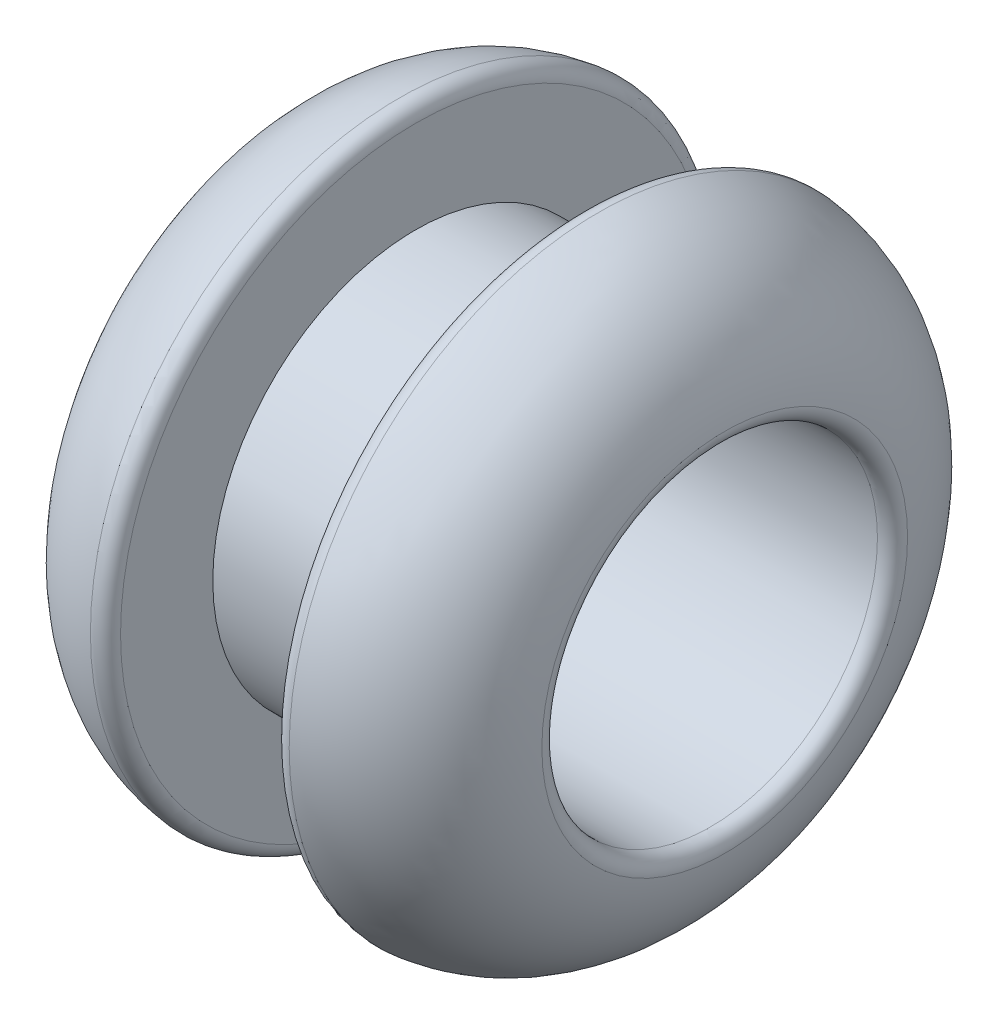
ISO-10303-21;
HEADER;
FILE_DESCRIPTION(('STEP AP214'),'2;1');
FILE_NAME('part.step','',(''),(''),'','','');
FILE_SCHEMA(('AUTOMOTIVE_DESIGN { 1 0 10303 214 1 1 1 1 }'));
ENDSEC;
DATA;
#1=APPLICATION_CONTEXT('core data for automotive mechanical design processes');
#2=APPLICATION_PROTOCOL_DEFINITION('international standard','automotive_design',2000,#1);
#3=PRODUCT_CONTEXT('',#1,'mechanical');
#4=PRODUCT('Part','Part','',(#3));
#5=PRODUCT_RELATED_PRODUCT_CATEGORY('part','',(#4));
#6=PRODUCT_DEFINITION_FORMATION('','',#4);
#7=PRODUCT_DEFINITION_CONTEXT('part definition',#1,'design');
#8=PRODUCT_DEFINITION('design','',#6,#7);
#9=PRODUCT_DEFINITION_SHAPE('','',#8);
#10=(LENGTH_UNIT() NAMED_UNIT(*) SI_UNIT(.MILLI.,.METRE.));
#11=(NAMED_UNIT(*) PLANE_ANGLE_UNIT() SI_UNIT($,.RADIAN.));
#12=(NAMED_UNIT(*) SI_UNIT($,.STERADIAN.) SOLID_ANGLE_UNIT());
#13=UNCERTAINTY_MEASURE_WITH_UNIT(LENGTH_MEASURE(1.E-05),#10,'distance_accuracy_value','');
#14=(GEOMETRIC_REPRESENTATION_CONTEXT(3) GLOBAL_UNCERTAINTY_ASSIGNED_CONTEXT((#13)) GLOBAL_UNIT_ASSIGNED_CONTEXT((#10,
#11,#12)) REPRESENTATION_CONTEXT('',''));
#15=CARTESIAN_POINT('',(0.,0.,0.));
#16=DIRECTION('',(0.,0.,1.));
#17=DIRECTION('',(1.,0.,0.));
#18=AXIS2_PLACEMENT_3D('',#15,#16,#17);
#19=CARTESIAN_POINT('',(-6.63598887259671,0.,1.75));
#20=DIRECTION('',(-1.,0.,0.));
#21=DIRECTION('',(0.,0.,1.));
#22=AXIS2_PLACEMENT_3D('',#19,#20,#21);
#23=CYLINDRICAL_SURFACE('',#22,1.75);
#24=CARTESIAN_POINT('',(-0.158359213500126,0.,1.75));
#25=DIRECTION('',(1.,0.,0.));
#26=DIRECTION('',(0.,0.,-1.));
#27=AXIS2_PLACEMENT_3D('',#24,#25,#26);
#28=CIRCLE('',#27,1.75);
#29=CARTESIAN_POINT('',(-0.158359213500126,0.,0.));
#30=VERTEX_POINT('',#29);
#31=EDGE_CURVE('E56',#30,#30,#28,.T.);
#32=ORIENTED_EDGE('',*,*,#31,.T.);
#33=EDGE_LOOP('',(#32));
#34=FACE_BOUND('',#33,.T.);
#35=CARTESIAN_POINT('',(-4.59164078649987,0.,1.75));
#36=DIRECTION('',(1.,0.,0.));
#37=DIRECTION('',(0.,0.,-1.));
#38=AXIS2_PLACEMENT_3D('',#35,#36,#37);
#39=CIRCLE('',#38,1.75);
#40=CARTESIAN_POINT('',(-4.59164078649987,0.,0.));
#41=VERTEX_POINT('',#40);
#42=EDGE_CURVE('E59',#41,#41,#39,.F.);
#43=ORIENTED_EDGE('',*,*,#42,.T.);
#44=EDGE_LOOP('',(#43));
#45=FACE_BOUND('',#44,.T.);
#46=ADVANCED_FACE('F36',(#34,#45),#23,.F.);
#47=CARTESIAN_POINT('',(-1.5,0.,1.75));
#48=DIRECTION('',(-1.,0.,0.));
#49=DIRECTION('',(0.,0.,1.));
#50=AXIS2_PLACEMENT_3D('',#47,#48,#49);
#51=TOROIDAL_SURFACE('',#50,1.75,1.5);
#52=CARTESIAN_POINT('',(-0.00928801500013209,0.,1.75));
#53=DIRECTION('',(-1.,0.,0.));
#54=DIRECTION('',(0.,0.,1.));
#55=AXIS2_PLACEMENT_3D('',#52,#53,#54);
#56=CIRCLE('',#55,1.91666666666667);
#57=CARTESIAN_POINT('',(-0.00928801500013209,0.,3.66666666666667));
#58=VERTEX_POINT('',#57);
#59=EDGE_CURVE('E62',#58,#58,#56,.T.);
#60=ORIENTED_EDGE('',*,*,#59,.T.);
#61=EDGE_LOOP('',(#60));
#62=FACE_BOUND('',#61,.T.);
#63=CARTESIAN_POINT('',(-1.33333333333333,0.,1.75));
#64=DIRECTION('',(-1.,0.,0.));
#65=DIRECTION('',(0.,0.,1.));
#66=AXIS2_PLACEMENT_3D('',#63,#64,#65);
#67=CIRCLE('',#66,3.24071198499986);
#68=CARTESIAN_POINT('',(-1.33333333333333,0.,4.99071198499986));
#69=VERTEX_POINT('',#68);
#70=EDGE_CURVE('E65',#69,#69,#67,.F.);
#71=ORIENTED_EDGE('',*,*,#70,.T.);
#72=EDGE_LOOP('',(#71));
#73=FACE_BOUND('',#72,.T.);
#74=ADVANCED_FACE('F88',(#62,#73),#51,.T.);
#75=CARTESIAN_POINT('',(-1.5,0.,0.));
#76=DIRECTION('',(-1.,0.,0.));
#77=DIRECTION('',(0.,0.,1.));
#78=AXIS2_PLACEMENT_3D('',#75,#76,#77);
#79=PLANE('',#78);
#80=CARTESIAN_POINT('',(-1.5,0.,1.75));
#81=DIRECTION('',(-1.,0.,0.));
#82=DIRECTION('',(0.,0.,1.));
#83=AXIS2_PLACEMENT_3D('',#80,#81,#82);
#84=CIRCLE('',#83,3.09164078649987);
#85=CARTESIAN_POINT('',(-1.5,0.,4.84164078649987));
#86=VERTEX_POINT('',#85);
#87=EDGE_CURVE('E10',#86,#86,#84,.T.);
#88=ORIENTED_EDGE('',*,*,#87,.T.);
#89=EDGE_LOOP('',(#88));
#90=FACE_BOUND('',#89,.T.);
#91=CARTESIAN_POINT('',(-1.5,0.,1.75));
#92=DIRECTION('',(-1.,0.,0.));
#93=DIRECTION('',(0.,0.,1.));
#94=AXIS2_PLACEMENT_3D('',#91,#92,#93);
#95=CIRCLE('',#94,2.125);
#96=CARTESIAN_POINT('',(-1.5,0.,3.875));
#97=VERTEX_POINT('',#96);
#98=EDGE_CURVE('E68',#97,#97,#95,.T.);
#99=ORIENTED_EDGE('',*,*,#98,.F.);
#100=EDGE_LOOP('',(#99));
#101=FACE_BOUND('',#100,.T.);
#102=ADVANCED_FACE('F79',(#90,#101),#79,.T.);
#103=CARTESIAN_POINT('',(-6.63598887259671,0.,1.75));
#104=DIRECTION('',(-1.,0.,0.));
#105=DIRECTION('',(0.,0.,1.));
#106=AXIS2_PLACEMENT_3D('',#103,#104,#105);
#107=CYLINDRICAL_SURFACE('',#106,2.125);
#108=ORIENTED_EDGE('',*,*,#98,.T.);
#109=EDGE_LOOP('',(#108));
#110=FACE_BOUND('',#109,.T.);
#111=CARTESIAN_POINT('',(-3.25,0.,1.75));
#112=DIRECTION('',(-1.,0.,0.));
#113=DIRECTION('',(0.,0.,1.));
#114=AXIS2_PLACEMENT_3D('',#111,#112,#113);
#115=CIRCLE('',#114,2.125);
#116=CARTESIAN_POINT('',(-3.25,0.,3.875));
#117=VERTEX_POINT('',#116);
#118=EDGE_CURVE('E71',#117,#117,#115,.T.);
#119=ORIENTED_EDGE('',*,*,#118,.F.);
#120=EDGE_LOOP('',(#119));
#121=FACE_BOUND('',#120,.T.);
#122=ADVANCED_FACE('F77',(#110,#121),#107,.T.);
#123=CARTESIAN_POINT('',(-3.25,0.,0.));
#124=DIRECTION('',(1.,0.,0.));
#125=DIRECTION('',(0.,0.,-1.));
#126=AXIS2_PLACEMENT_3D('',#123,#124,#125);
#127=PLANE('',#126);
#128=CARTESIAN_POINT('',(-3.25,0.,1.75));
#129=DIRECTION('',(1.,0.,0.));
#130=DIRECTION('',(0.,0.,-1.));
#131=AXIS2_PLACEMENT_3D('',#128,#129,#130);
#132=CIRCLE('',#131,3.09164078649987);
#133=CARTESIAN_POINT('',(-3.25,0.,-1.34164078649987));
#134=VERTEX_POINT('',#133);
#135=EDGE_CURVE('E43',#134,#134,#132,.T.);
#136=ORIENTED_EDGE('',*,*,#135,.T.);
#137=EDGE_LOOP('',(#136));
#138=FACE_BOUND('',#137,.T.);
#139=ORIENTED_EDGE('',*,*,#118,.T.);
#140=EDGE_LOOP('',(#139));
#141=FACE_BOUND('',#140,.T.);
#142=ADVANCED_FACE('F75',(#138,#141),#127,.T.);
#143=CARTESIAN_POINT('',(-3.25,0.,1.75));
#144=DIRECTION('',(-1.,0.,0.));
#145=DIRECTION('',(0.,0.,1.));
#146=AXIS2_PLACEMENT_3D('',#143,#144,#145);
#147=TOROIDAL_SURFACE('',#146,1.75,1.5);
#148=CARTESIAN_POINT('',(-4.74071198499987,0.,1.75));
#149=DIRECTION('',(1.,0.,0.));
#150=DIRECTION('',(0.,0.,-1.));
#151=AXIS2_PLACEMENT_3D('',#148,#149,#150);
#152=CIRCLE('',#151,1.91666666666667);
#153=CARTESIAN_POINT('',(-4.74071198499987,0.,-0.166666666666668));
#154=VERTEX_POINT('',#153);
#155=EDGE_CURVE('E47',#154,#154,#152,.T.);
#156=ORIENTED_EDGE('',*,*,#155,.T.);
#157=EDGE_LOOP('',(#156));
#158=FACE_BOUND('',#157,.T.);
#159=CARTESIAN_POINT('',(-3.41666666666667,0.,1.75));
#160=DIRECTION('',(1.,0.,0.));
#161=DIRECTION('',(0.,0.,-1.));
#162=AXIS2_PLACEMENT_3D('',#159,#160,#161);
#163=CIRCLE('',#162,3.24071198499986);
#164=CARTESIAN_POINT('',(-3.41666666666667,0.,-1.49071198499986));
#165=VERTEX_POINT('',#164);
#166=EDGE_CURVE('E51',#165,#165,#163,.F.);
#167=ORIENTED_EDGE('',*,*,#166,.T.);
#168=EDGE_LOOP('',(#167));
#169=FACE_BOUND('',#168,.T.);
#170=ADVANCED_FACE('F86',(#158,#169),#147,.T.);
#171=CARTESIAN_POINT('',(-0.158359213500126,0.,1.75));
#172=DIRECTION('',(1.,0.,0.));
#173=DIRECTION('',(0.,0.,-1.));
#174=AXIS2_PLACEMENT_3D('',#171,#172,#173);
#175=TOROIDAL_SURFACE('',#174,1.9,0.15);
#176=ORIENTED_EDGE('',*,*,#31,.F.);
#177=EDGE_LOOP('',(#176));
#178=FACE_BOUND('',#177,.T.);
#179=ORIENTED_EDGE('',*,*,#59,.F.);
#180=EDGE_LOOP('',(#179));
#181=FACE_BOUND('',#180,.T.);
#182=ADVANCED_FACE('F100',(#178,#181),#175,.T.);
#183=CARTESIAN_POINT('',(-4.59164078649987,0.,1.75));
#184=DIRECTION('',(1.,0.,0.));
#185=DIRECTION('',(0.,0.,-1.));
#186=AXIS2_PLACEMENT_3D('',#183,#184,#185);
#187=TOROIDAL_SURFACE('',#186,1.9,0.15);
#188=ORIENTED_EDGE('',*,*,#155,.F.);
#189=EDGE_LOOP('',(#188));
#190=FACE_BOUND('',#189,.T.);
#191=ORIENTED_EDGE('',*,*,#42,.F.);
#192=EDGE_LOOP('',(#191));
#193=FACE_BOUND('',#192,.T.);
#194=ADVANCED_FACE('F103',(#190,#193),#187,.T.);
#195=CARTESIAN_POINT('',(-3.4,0.,1.75));
#196=DIRECTION('',(1.,0.,0.));
#197=DIRECTION('',(0.,0.,-1.));
#198=AXIS2_PLACEMENT_3D('',#195,#196,#197);
#199=TOROIDAL_SURFACE('',#198,3.09164078649987,0.15);
#200=ORIENTED_EDGE('',*,*,#135,.F.);
#201=EDGE_LOOP('',(#200));
#202=FACE_BOUND('',#201,.T.);
#203=ORIENTED_EDGE('',*,*,#166,.F.);
#204=EDGE_LOOP('',(#203));
#205=FACE_BOUND('',#204,.T.);
#206=ADVANCED_FACE('F106',(#202,#205),#199,.T.);
#207=CARTESIAN_POINT('',(-1.35,0.,1.75));
#208=DIRECTION('',(-1.,0.,0.));
#209=DIRECTION('',(0.,0.,1.));
#210=AXIS2_PLACEMENT_3D('',#207,#208,#209);
#211=TOROIDAL_SURFACE('',#210,3.09164078649987,0.15);
#212=ORIENTED_EDGE('',*,*,#70,.F.);
#213=EDGE_LOOP('',(#212));
#214=FACE_BOUND('',#213,.T.);
#215=ORIENTED_EDGE('',*,*,#87,.F.);
#216=EDGE_LOOP('',(#215));
#217=FACE_BOUND('',#216,.T.);
#218=ADVANCED_FACE('F38',(#214,#217),#211,.T.);
#219=CLOSED_SHELL('',(#46,#74,#102,#122,#142,#170,#182,#194,#206,#218));
#220=MANIFOLD_SOLID_BREP('B2',#219);
#221=ADVANCED_BREP_SHAPE_REPRESENTATION('',(#18,#220),#14);
#222=SHAPE_DEFINITION_REPRESENTATION(#9,#221);
ENDSEC;
END-ISO-10303-21;
